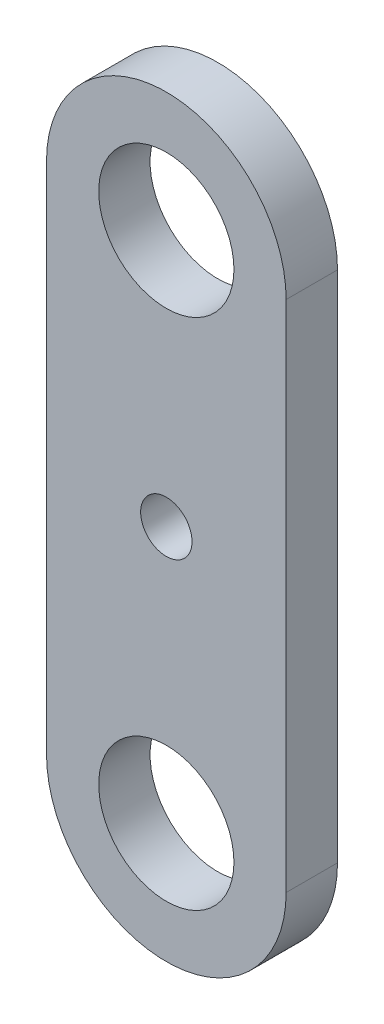
ISO-10303-21;
HEADER;
FILE_DESCRIPTION(('STEP AP214'),'2;1');
FILE_NAME('part.step','',(''),(''),'','','');
FILE_SCHEMA(('AUTOMOTIVE_DESIGN { 1 0 10303 214 1 1 1 1 }'));
ENDSEC;
DATA;
#1=APPLICATION_CONTEXT('core data for automotive mechanical design processes');
#2=APPLICATION_PROTOCOL_DEFINITION('international standard','automotive_design',2000,#1);
#3=PRODUCT_CONTEXT('',#1,'mechanical');
#4=PRODUCT('Part','Part','',(#3));
#5=PRODUCT_RELATED_PRODUCT_CATEGORY('part','',(#4));
#6=PRODUCT_DEFINITION_FORMATION('','',#4);
#7=PRODUCT_DEFINITION_CONTEXT('part definition',#1,'design');
#8=PRODUCT_DEFINITION('design','',#6,#7);
#9=PRODUCT_DEFINITION_SHAPE('','',#8);
#10=(LENGTH_UNIT() NAMED_UNIT(*) SI_UNIT(.MILLI.,.METRE.));
#11=(NAMED_UNIT(*) PLANE_ANGLE_UNIT() SI_UNIT($,.RADIAN.));
#12=(NAMED_UNIT(*) SI_UNIT($,.STERADIAN.) SOLID_ANGLE_UNIT());
#13=UNCERTAINTY_MEASURE_WITH_UNIT(LENGTH_MEASURE(1.E-05),#10,'distance_accuracy_value','');
#14=(GEOMETRIC_REPRESENTATION_CONTEXT(3) GLOBAL_UNCERTAINTY_ASSIGNED_CONTEXT((#13)) GLOBAL_UNIT_ASSIGNED_CONTEXT((#10,
#11,#12)) REPRESENTATION_CONTEXT('',''));
#15=CARTESIAN_POINT('',(0.,0.,0.));
#16=DIRECTION('',(0.,0.,1.));
#17=DIRECTION('',(1.,0.,0.));
#18=AXIS2_PLACEMENT_3D('',#15,#16,#17);
#19=CARTESIAN_POINT('',(0.,30.,3.));
#20=DIRECTION('',(0.,0.,-1.));
#21=DIRECTION('',(-1.,0.,0.));
#22=AXIS2_PLACEMENT_3D('',#19,#20,#21);
#23=CYLINDRICAL_SURFACE('',#22,7.);
#24=CARTESIAN_POINT('',(0.,30.,0.));
#25=DIRECTION('',(0.,0.,1.));
#26=DIRECTION('',(1.,0.,0.));
#27=AXIS2_PLACEMENT_3D('',#24,#25,#26);
#28=CIRCLE('',#27,7.);
#29=CARTESIAN_POINT('',(7.,30.,0.));
#30=VERTEX_POINT('',#29);
#31=CARTESIAN_POINT('',(-7.,30.,0.));
#32=VERTEX_POINT('',#31);
#33=EDGE_CURVE('E112',#30,#32,#28,.T.);
#34=ORIENTED_EDGE('',*,*,#33,.T.);
#35=DIRECTION('',(0.,0.,-1.));
#36=VECTOR('',#35,1.);
#37=CARTESIAN_POINT('',(-7.,30.,3.));
#38=LINE('',#37,#36);
#39=CARTESIAN_POINT('',(-7.,30.,3.));
#40=VERTEX_POINT('',#39);
#41=EDGE_CURVE('E11',#40,#32,#38,.T.);
#42=ORIENTED_EDGE('',*,*,#41,.F.);
#43=CARTESIAN_POINT('',(0.,30.,3.));
#44=DIRECTION('',(0.,0.,1.));
#45=DIRECTION('',(1.,0.,0.));
#46=AXIS2_PLACEMENT_3D('',#43,#44,#45);
#47=CIRCLE('',#46,7.);
#48=CARTESIAN_POINT('',(7.,30.,3.));
#49=VERTEX_POINT('',#48);
#50=EDGE_CURVE('E91',#49,#40,#47,.T.);
#51=ORIENTED_EDGE('',*,*,#50,.F.);
#52=DIRECTION('',(0.,0.,-1.));
#53=VECTOR('',#52,1.);
#54=CARTESIAN_POINT('',(7.,30.,3.));
#55=LINE('',#54,#53);
#56=EDGE_CURVE('E108',#49,#30,#55,.T.);
#57=ORIENTED_EDGE('',*,*,#56,.T.);
#58=EDGE_LOOP('',(#34,#42,#51,#57));
#59=FACE_BOUND('',#58,.T.);
#60=ADVANCED_FACE('F38',(#59),#23,.T.);
#61=CARTESIAN_POINT('',(-7.,0.,3.));
#62=DIRECTION('',(1.,0.,0.));
#63=DIRECTION('',(0.,1.,0.));
#64=AXIS2_PLACEMENT_3D('',#61,#62,#63);
#65=PLANE('',#64);
#66=DIRECTION('',(0.,-1.,0.));
#67=VECTOR('',#66,1.);
#68=CARTESIAN_POINT('',(-7.,0.,0.));
#69=LINE('',#68,#67);
#70=CARTESIAN_POINT('',(-7.,0.,0.));
#71=VERTEX_POINT('',#70);
#72=EDGE_CURVE('E95',#32,#71,#69,.T.);
#73=ORIENTED_EDGE('',*,*,#72,.T.);
#74=DIRECTION('',(0.,0.,-1.));
#75=VECTOR('',#74,1.);
#76=CARTESIAN_POINT('',(-7.,0.,3.));
#77=LINE('',#76,#75);
#78=CARTESIAN_POINT('',(-7.,0.,3.));
#79=VERTEX_POINT('',#78);
#80=EDGE_CURVE('E47',#79,#71,#77,.T.);
#81=ORIENTED_EDGE('',*,*,#80,.F.);
#82=DIRECTION('',(0.,-1.,0.));
#83=VECTOR('',#82,1.);
#84=CARTESIAN_POINT('',(-7.,0.,3.));
#85=LINE('',#84,#83);
#86=EDGE_CURVE('E85',#40,#79,#85,.T.);
#87=ORIENTED_EDGE('',*,*,#86,.F.);
#88=ORIENTED_EDGE('',*,*,#41,.T.);
#89=EDGE_LOOP('',(#73,#81,#87,#88));
#90=FACE_BOUND('',#89,.T.);
#91=ADVANCED_FACE('F94',(#90),#65,.F.);
#92=CARTESIAN_POINT('',(0.,0.,3.));
#93=DIRECTION('',(0.,0.,-1.));
#94=DIRECTION('',(-1.,0.,0.));
#95=AXIS2_PLACEMENT_3D('',#92,#93,#94);
#96=CYLINDRICAL_SURFACE('',#95,7.);
#97=CARTESIAN_POINT('',(0.,0.,0.));
#98=DIRECTION('',(0.,0.,1.));
#99=DIRECTION('',(1.,0.,0.));
#100=AXIS2_PLACEMENT_3D('',#97,#98,#99);
#101=CIRCLE('',#100,7.);
#102=CARTESIAN_POINT('',(7.,0.,0.));
#103=VERTEX_POINT('',#102);
#104=EDGE_CURVE('E72',#71,#103,#101,.T.);
#105=ORIENTED_EDGE('',*,*,#104,.T.);
#106=DIRECTION('',(0.,0.,-1.));
#107=VECTOR('',#106,1.);
#108=CARTESIAN_POINT('',(7.,0.,3.));
#109=LINE('',#108,#107);
#110=CARTESIAN_POINT('',(7.,0.,3.));
#111=VERTEX_POINT('',#110);
#112=EDGE_CURVE('E96',#111,#103,#109,.T.);
#113=ORIENTED_EDGE('',*,*,#112,.F.);
#114=CARTESIAN_POINT('',(0.,0.,3.));
#115=DIRECTION('',(0.,0.,1.));
#116=DIRECTION('',(1.,0.,0.));
#117=AXIS2_PLACEMENT_3D('',#114,#115,#116);
#118=CIRCLE('',#117,7.);
#119=EDGE_CURVE('E89',#79,#111,#118,.T.);
#120=ORIENTED_EDGE('',*,*,#119,.F.);
#121=ORIENTED_EDGE('',*,*,#80,.T.);
#122=EDGE_LOOP('',(#105,#113,#120,#121));
#123=FACE_BOUND('',#122,.T.);
#124=ADVANCED_FACE('F97',(#123),#96,.T.);
#125=CARTESIAN_POINT('',(0.,15.,3.));
#126=DIRECTION('',(0.,0.,-1.));
#127=DIRECTION('',(-1.,0.,0.));
#128=AXIS2_PLACEMENT_3D('',#125,#126,#127);
#129=CYLINDRICAL_SURFACE('',#128,1.5);
#130=CARTESIAN_POINT('',(0.,15.,3.));
#131=DIRECTION('',(0.,0.,1.));
#132=DIRECTION('',(1.,0.,0.));
#133=AXIS2_PLACEMENT_3D('',#130,#131,#132);
#134=CIRCLE('',#133,1.5);
#135=CARTESIAN_POINT('',(1.5,15.,3.));
#136=VERTEX_POINT('',#135);
#137=EDGE_CURVE('E99',#136,#136,#134,.T.);
#138=ORIENTED_EDGE('',*,*,#137,.T.);
#139=EDGE_LOOP('',(#138));
#140=FACE_BOUND('',#139,.T.);
#141=CARTESIAN_POINT('',(0.,15.,0.));
#142=DIRECTION('',(0.,0.,1.));
#143=DIRECTION('',(1.,0.,0.));
#144=AXIS2_PLACEMENT_3D('',#141,#142,#143);
#145=CIRCLE('',#144,1.5);
#146=CARTESIAN_POINT('',(1.5,15.,0.));
#147=VERTEX_POINT('',#146);
#148=EDGE_CURVE('E118',#147,#147,#145,.T.);
#149=ORIENTED_EDGE('',*,*,#148,.F.);
#150=EDGE_LOOP('',(#149));
#151=FACE_BOUND('',#150,.T.);
#152=ADVANCED_FACE('F157',(#140,#151),#129,.F.);
#153=CARTESIAN_POINT('',(7.,0.,3.));
#154=DIRECTION('',(-1.,0.,0.));
#155=DIRECTION('',(0.,-1.,0.));
#156=AXIS2_PLACEMENT_3D('',#153,#154,#155);
#157=PLANE('',#156);
#158=DIRECTION('',(0.,1.,0.));
#159=VECTOR('',#158,1.);
#160=CARTESIAN_POINT('',(7.,0.,0.));
#161=LINE('',#160,#159);
#162=EDGE_CURVE('E78',#103,#30,#161,.T.);
#163=ORIENTED_EDGE('',*,*,#162,.T.);
#164=ORIENTED_EDGE('',*,*,#56,.F.);
#165=DIRECTION('',(0.,1.,0.));
#166=VECTOR('',#165,1.);
#167=CARTESIAN_POINT('',(7.,0.,3.));
#168=LINE('',#167,#166);
#169=EDGE_CURVE('E55',#111,#49,#168,.T.);
#170=ORIENTED_EDGE('',*,*,#169,.F.);
#171=ORIENTED_EDGE('',*,*,#112,.T.);
#172=EDGE_LOOP('',(#163,#164,#170,#171));
#173=FACE_BOUND('',#172,.T.);
#174=ADVANCED_FACE('F126',(#173),#157,.F.);
#175=CARTESIAN_POINT('',(0.,30.,3.));
#176=DIRECTION('',(0.,0.,-1.));
#177=DIRECTION('',(-1.,0.,0.));
#178=AXIS2_PLACEMENT_3D('',#175,#176,#177);
#179=CYLINDRICAL_SURFACE('',#178,3.95);
#180=CARTESIAN_POINT('',(0.,30.,3.));
#181=DIRECTION('',(0.,0.,1.));
#182=DIRECTION('',(1.,0.,0.));
#183=AXIS2_PLACEMENT_3D('',#180,#181,#182);
#184=CIRCLE('',#183,3.95);
#185=CARTESIAN_POINT('',(3.95,30.,3.));
#186=VERTEX_POINT('',#185);
#187=EDGE_CURVE('E124',#186,#186,#184,.T.);
#188=ORIENTED_EDGE('',*,*,#187,.T.);
#189=EDGE_LOOP('',(#188));
#190=FACE_BOUND('',#189,.T.);
#191=CARTESIAN_POINT('',(0.,30.,0.));
#192=DIRECTION('',(0.,0.,1.));
#193=DIRECTION('',(1.,0.,0.));
#194=AXIS2_PLACEMENT_3D('',#191,#192,#193);
#195=CIRCLE('',#194,3.95);
#196=CARTESIAN_POINT('',(3.95,30.,0.));
#197=VERTEX_POINT('',#196);
#198=EDGE_CURVE('E109',#197,#197,#195,.T.);
#199=ORIENTED_EDGE('',*,*,#198,.F.);
#200=EDGE_LOOP('',(#199));
#201=FACE_BOUND('',#200,.T.);
#202=ADVANCED_FACE('F40',(#190,#201),#179,.F.);
#203=CARTESIAN_POINT('',(0.,0.,3.));
#204=DIRECTION('',(0.,0.,-1.));
#205=DIRECTION('',(-1.,0.,0.));
#206=AXIS2_PLACEMENT_3D('',#203,#204,#205);
#207=CYLINDRICAL_SURFACE('',#206,3.95);
#208=CARTESIAN_POINT('',(0.,0.,3.));
#209=DIRECTION('',(0.,0.,1.));
#210=DIRECTION('',(1.,0.,0.));
#211=AXIS2_PLACEMENT_3D('',#208,#209,#210);
#212=CIRCLE('',#211,3.95);
#213=CARTESIAN_POINT('',(3.95,0.,3.));
#214=VERTEX_POINT('',#213);
#215=EDGE_CURVE('E105',#214,#214,#212,.T.);
#216=ORIENTED_EDGE('',*,*,#215,.T.);
#217=EDGE_LOOP('',(#216));
#218=FACE_BOUND('',#217,.T.);
#219=CARTESIAN_POINT('',(0.,0.,0.));
#220=DIRECTION('',(0.,0.,1.));
#221=DIRECTION('',(1.,0.,0.));
#222=AXIS2_PLACEMENT_3D('',#219,#220,#221);
#223=CIRCLE('',#222,3.95);
#224=CARTESIAN_POINT('',(3.95,0.,0.));
#225=VERTEX_POINT('',#224);
#226=EDGE_CURVE('E121',#225,#225,#223,.T.);
#227=ORIENTED_EDGE('',*,*,#226,.F.);
#228=EDGE_LOOP('',(#227));
#229=FACE_BOUND('',#228,.T.);
#230=ADVANCED_FACE('F139',(#218,#229),#207,.F.);
#231=CARTESIAN_POINT('',(0.,0.,3.));
#232=DIRECTION('',(0.,0.,1.));
#233=DIRECTION('',(1.,0.,0.));
#234=AXIS2_PLACEMENT_3D('',#231,#232,#233);
#235=PLANE('',#234);
#236=ORIENTED_EDGE('',*,*,#187,.F.);
#237=EDGE_LOOP('',(#236));
#238=FACE_BOUND('',#237,.T.);
#239=ORIENTED_EDGE('',*,*,#50,.T.);
#240=ORIENTED_EDGE('',*,*,#86,.T.);
#241=ORIENTED_EDGE('',*,*,#119,.T.);
#242=ORIENTED_EDGE('',*,*,#169,.T.);
#243=EDGE_LOOP('',(#239,#240,#241,#242));
#244=FACE_BOUND('',#243,.T.);
#245=ORIENTED_EDGE('',*,*,#137,.F.);
#246=EDGE_LOOP('',(#245));
#247=FACE_BOUND('',#246,.T.);
#248=ORIENTED_EDGE('',*,*,#215,.F.);
#249=EDGE_LOOP('',(#248));
#250=FACE_BOUND('',#249,.T.);
#251=ADVANCED_FACE('F86',(#238,#244,#247,#250),#235,.T.);
#252=CARTESIAN_POINT('',(0.,0.,0.));
#253=DIRECTION('',(0.,0.,1.));
#254=DIRECTION('',(1.,0.,0.));
#255=AXIS2_PLACEMENT_3D('',#252,#253,#254);
#256=PLANE('',#255);
#257=ORIENTED_EDGE('',*,*,#198,.T.);
#258=EDGE_LOOP('',(#257));
#259=FACE_BOUND('',#258,.T.);
#260=ORIENTED_EDGE('',*,*,#33,.F.);
#261=ORIENTED_EDGE('',*,*,#162,.F.);
#262=ORIENTED_EDGE('',*,*,#104,.F.);
#263=ORIENTED_EDGE('',*,*,#72,.F.);
#264=EDGE_LOOP('',(#260,#261,#262,#263));
#265=FACE_BOUND('',#264,.T.);
#266=ORIENTED_EDGE('',*,*,#148,.T.);
#267=EDGE_LOOP('',(#266));
#268=FACE_BOUND('',#267,.T.);
#269=ORIENTED_EDGE('',*,*,#226,.T.);
#270=EDGE_LOOP('',(#269));
#271=FACE_BOUND('',#270,.T.);
#272=ADVANCED_FACE('F129',(#259,#265,#268,#271),#256,.F.);
#273=CLOSED_SHELL('',(#60,#91,#124,#152,#174,#202,#230,#251,#272));
#274=MANIFOLD_SOLID_BREP('B2',#273);
#275=ADVANCED_BREP_SHAPE_REPRESENTATION('',(#18,#274),#14);
#276=SHAPE_DEFINITION_REPRESENTATION(#9,#275);
ENDSEC;
END-ISO-10303-21;
